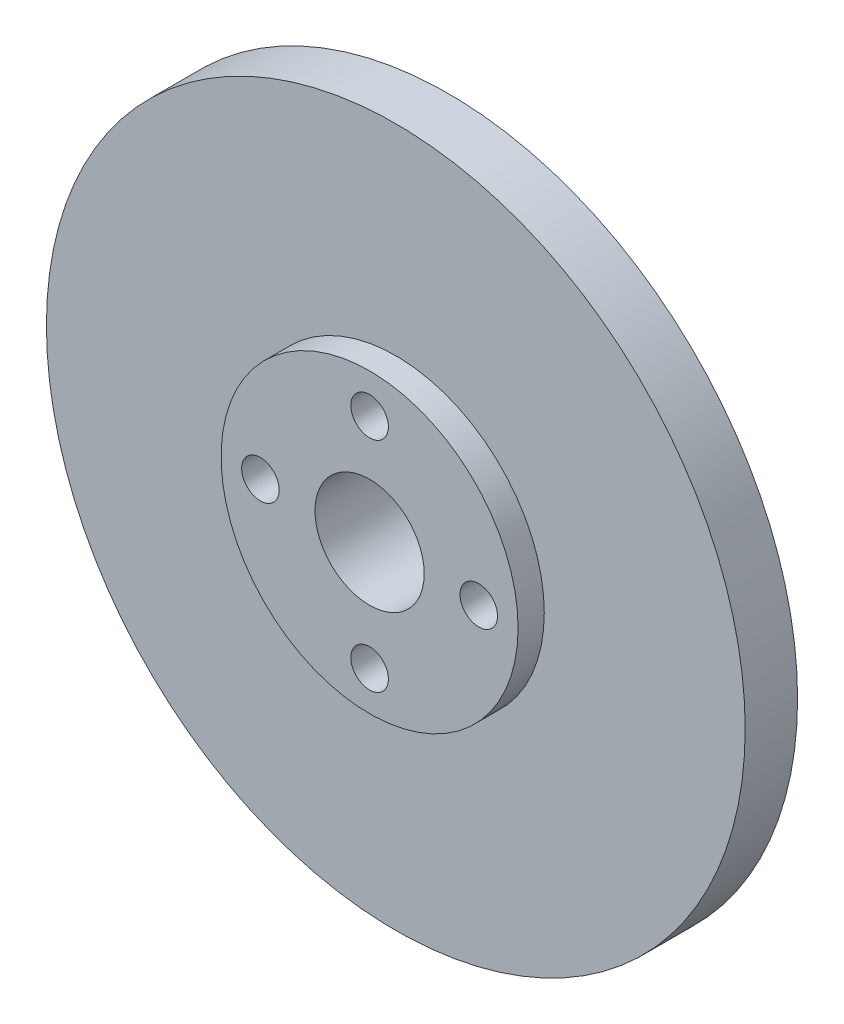
ISO-10303-21;
HEADER;
FILE_DESCRIPTION(('STEP AP214'),'2;1');
FILE_NAME('part.step','',(''),(''),'','','');
FILE_SCHEMA(('AUTOMOTIVE_DESIGN { 1 0 10303 214 1 1 1 1 }'));
ENDSEC;
DATA;
#1=APPLICATION_CONTEXT('core data for automotive mechanical design processes');
#2=APPLICATION_PROTOCOL_DEFINITION('international standard','automotive_design',2000,#1);
#3=PRODUCT_CONTEXT('',#1,'mechanical');
#4=PRODUCT('Part','Part','',(#3));
#5=PRODUCT_RELATED_PRODUCT_CATEGORY('part','',(#4));
#6=PRODUCT_DEFINITION_FORMATION('','',#4);
#7=PRODUCT_DEFINITION_CONTEXT('part definition',#1,'design');
#8=PRODUCT_DEFINITION('design','',#6,#7);
#9=PRODUCT_DEFINITION_SHAPE('','',#8);
#10=(LENGTH_UNIT() NAMED_UNIT(*) SI_UNIT(.MILLI.,.METRE.));
#11=(NAMED_UNIT(*) PLANE_ANGLE_UNIT() SI_UNIT($,.RADIAN.));
#12=(NAMED_UNIT(*) SI_UNIT($,.STERADIAN.) SOLID_ANGLE_UNIT());
#13=UNCERTAINTY_MEASURE_WITH_UNIT(LENGTH_MEASURE(1.E-05),#10,'distance_accuracy_value','');
#14=(GEOMETRIC_REPRESENTATION_CONTEXT(3) GLOBAL_UNCERTAINTY_ASSIGNED_CONTEXT((#13)) GLOBAL_UNIT_ASSIGNED_CONTEXT((#10,
#11,#12)) REPRESENTATION_CONTEXT('',''));
#15=CARTESIAN_POINT('',(0.,0.,0.));
#16=DIRECTION('',(0.,0.,1.));
#17=DIRECTION('',(1.,0.,0.));
#18=AXIS2_PLACEMENT_3D('',#15,#16,#17);
#19=CARTESIAN_POINT('',(0.,0.,6.));
#20=DIRECTION('',(0.,0.,-1.));
#21=DIRECTION('',(-1.,0.,0.));
#22=AXIS2_PLACEMENT_3D('',#19,#20,#21);
#23=CYLINDRICAL_SURFACE('',#22,40.);
#24=CARTESIAN_POINT('',(0.,0.,6.));
#25=DIRECTION('',(0.,0.,1.));
#26=DIRECTION('',(1.,0.,0.));
#27=AXIS2_PLACEMENT_3D('',#24,#25,#26);
#28=CIRCLE('',#27,40.);
#29=CARTESIAN_POINT('',(40.,0.,6.));
#30=VERTEX_POINT('',#29);
#31=EDGE_CURVE('E49',#30,#30,#28,.T.);
#32=ORIENTED_EDGE('',*,*,#31,.F.);
#33=EDGE_LOOP('',(#32));
#34=FACE_BOUND('',#33,.T.);
#35=CARTESIAN_POINT('',(0.,0.,0.));
#36=DIRECTION('',(0.,0.,1.));
#37=DIRECTION('',(1.,0.,0.));
#38=AXIS2_PLACEMENT_3D('',#35,#36,#37);
#39=CIRCLE('',#38,40.);
#40=CARTESIAN_POINT('',(40.,0.,0.));
#41=VERTEX_POINT('',#40);
#42=EDGE_CURVE('E55',#41,#41,#39,.T.);
#43=ORIENTED_EDGE('',*,*,#42,.T.);
#44=EDGE_LOOP('',(#43));
#45=FACE_BOUND('',#44,.T.);
#46=ADVANCED_FACE('F41',(#34,#45),#23,.T.);
#47=CARTESIAN_POINT('',(0.,0.,6.));
#48=DIRECTION('',(0.,0.,1.));
#49=DIRECTION('',(1.,0.,0.));
#50=AXIS2_PLACEMENT_3D('',#47,#48,#49);
#51=PLANE('',#50);
#52=CARTESIAN_POINT('',(0.,0.,6.));
#53=DIRECTION('',(0.,0.,1.));
#54=DIRECTION('',(1.,0.,0.));
#55=AXIS2_PLACEMENT_3D('',#52,#53,#54);
#56=CIRCLE('',#55,17.);
#57=CARTESIAN_POINT('',(17.,0.,6.));
#58=VERTEX_POINT('',#57);
#59=EDGE_CURVE('E10',#58,#58,#56,.T.);
#60=ORIENTED_EDGE('',*,*,#59,.F.);
#61=EDGE_LOOP('',(#60));
#62=FACE_BOUND('',#61,.T.);
#63=ORIENTED_EDGE('',*,*,#31,.T.);
#64=EDGE_LOOP('',(#63));
#65=FACE_BOUND('',#64,.T.);
#66=ADVANCED_FACE('F102',(#62,#65),#51,.T.);
#67=CARTESIAN_POINT('',(0.,0.,0.));
#68=DIRECTION('',(0.,0.,1.));
#69=DIRECTION('',(1.,0.,0.));
#70=AXIS2_PLACEMENT_3D('',#67,#68,#69);
#71=PLANE('',#70);
#72=CARTESIAN_POINT('',(0.,12.5,0.));
#73=DIRECTION('',(0.,0.,1.));
#74=DIRECTION('',(1.,0.,0.));
#75=AXIS2_PLACEMENT_3D('',#72,#73,#74);
#76=CIRCLE('',#75,2.15);
#77=CARTESIAN_POINT('',(2.15,12.5,0.));
#78=VERTEX_POINT('',#77);
#79=EDGE_CURVE('E212',#78,#78,#76,.T.);
#80=ORIENTED_EDGE('',*,*,#79,.T.);
#81=EDGE_LOOP('',(#80));
#82=FACE_BOUND('',#81,.T.);
#83=CARTESIAN_POINT('',(12.5,0.,0.));
#84=DIRECTION('',(0.,0.,1.));
#85=DIRECTION('',(1.,0.,0.));
#86=AXIS2_PLACEMENT_3D('',#83,#84,#85);
#87=CIRCLE('',#86,2.15);
#88=CARTESIAN_POINT('',(14.65,0.,0.));
#89=VERTEX_POINT('',#88);
#90=EDGE_CURVE('E214',#89,#89,#87,.T.);
#91=ORIENTED_EDGE('',*,*,#90,.T.);
#92=EDGE_LOOP('',(#91));
#93=FACE_BOUND('',#92,.T.);
#94=CARTESIAN_POINT('',(0.,-12.5,0.));
#95=DIRECTION('',(0.,0.,1.));
#96=DIRECTION('',(1.,0.,0.));
#97=AXIS2_PLACEMENT_3D('',#94,#95,#96);
#98=CIRCLE('',#97,2.15);
#99=CARTESIAN_POINT('',(2.14999999999991,-12.5,0.));
#100=VERTEX_POINT('',#99);
#101=EDGE_CURVE('E220',#100,#100,#98,.T.);
#102=ORIENTED_EDGE('',*,*,#101,.T.);
#103=EDGE_LOOP('',(#102));
#104=FACE_BOUND('',#103,.T.);
#105=CARTESIAN_POINT('',(-12.5,1.30930550206618E-13,0.));
#106=DIRECTION('',(0.,0.,1.));
#107=DIRECTION('',(1.,0.,0.));
#108=AXIS2_PLACEMENT_3D('',#105,#106,#107);
#109=CIRCLE('',#108,2.15);
#110=CARTESIAN_POINT('',(-10.35,1.30930550206618E-13,0.));
#111=VERTEX_POINT('',#110);
#112=EDGE_CURVE('E223',#111,#111,#109,.T.);
#113=ORIENTED_EDGE('',*,*,#112,.T.);
#114=EDGE_LOOP('',(#113));
#115=FACE_BOUND('',#114,.T.);
#116=CARTESIAN_POINT('',(0.,0.,0.));
#117=DIRECTION('',(0.,0.,1.));
#118=DIRECTION('',(1.,0.,0.));
#119=AXIS2_PLACEMENT_3D('',#116,#117,#118);
#120=CIRCLE('',#119,6.25);
#121=CARTESIAN_POINT('',(6.25,0.,0.));
#122=VERTEX_POINT('',#121);
#123=EDGE_CURVE('E69',#122,#122,#120,.T.);
#124=ORIENTED_EDGE('',*,*,#123,.T.);
#125=EDGE_LOOP('',(#124));
#126=FACE_BOUND('',#125,.T.);
#127=ORIENTED_EDGE('',*,*,#42,.F.);
#128=EDGE_LOOP('',(#127));
#129=FACE_BOUND('',#128,.T.);
#130=ADVANCED_FACE('F93',(#82,#93,#104,#115,#126,#129),#71,.F.);
#131=CARTESIAN_POINT('',(0.,0.,9.));
#132=DIRECTION('',(0.,0.,-1.));
#133=DIRECTION('',(-1.,0.,0.));
#134=AXIS2_PLACEMENT_3D('',#131,#132,#133);
#135=CYLINDRICAL_SURFACE('',#134,17.);
#136=CARTESIAN_POINT('',(0.,0.,9.));
#137=DIRECTION('',(0.,0.,1.));
#138=DIRECTION('',(1.,0.,0.));
#139=AXIS2_PLACEMENT_3D('',#136,#137,#138);
#140=CIRCLE('',#139,17.);
#141=CARTESIAN_POINT('',(17.,0.,9.));
#142=VERTEX_POINT('',#141);
#143=EDGE_CURVE('E58',#142,#142,#140,.T.);
#144=ORIENTED_EDGE('',*,*,#143,.F.);
#145=EDGE_LOOP('',(#144));
#146=FACE_BOUND('',#145,.T.);
#147=ORIENTED_EDGE('',*,*,#59,.T.);
#148=EDGE_LOOP('',(#147));
#149=FACE_BOUND('',#148,.T.);
#150=ADVANCED_FACE('F91',(#146,#149),#135,.T.);
#151=CARTESIAN_POINT('',(0.,0.,9.));
#152=DIRECTION('',(0.,0.,1.));
#153=DIRECTION('',(1.,0.,0.));
#154=AXIS2_PLACEMENT_3D('',#151,#152,#153);
#155=PLANE('',#154);
#156=CARTESIAN_POINT('',(0.,12.5,9.));
#157=DIRECTION('',(0.,0.,1.));
#158=DIRECTION('',(1.,0.,0.));
#159=AXIS2_PLACEMENT_3D('',#156,#157,#158);
#160=CIRCLE('',#159,2.15);
#161=CARTESIAN_POINT('',(2.15,12.5,9.));
#162=VERTEX_POINT('',#161);
#163=EDGE_CURVE('E44',#162,#162,#160,.T.);
#164=ORIENTED_EDGE('',*,*,#163,.F.);
#165=EDGE_LOOP('',(#164));
#166=FACE_BOUND('',#165,.T.);
#167=CARTESIAN_POINT('',(12.5,0.,9.));
#168=DIRECTION('',(0.,0.,1.));
#169=DIRECTION('',(1.,0.,0.));
#170=AXIS2_PLACEMENT_3D('',#167,#168,#169);
#171=CIRCLE('',#170,2.15);
#172=CARTESIAN_POINT('',(14.65,0.,9.));
#173=VERTEX_POINT('',#172);
#174=EDGE_CURVE('E76',#173,#173,#171,.T.);
#175=ORIENTED_EDGE('',*,*,#174,.F.);
#176=EDGE_LOOP('',(#175));
#177=FACE_BOUND('',#176,.T.);
#178=CARTESIAN_POINT('',(0.,-12.5,9.));
#179=DIRECTION('',(0.,0.,1.));
#180=DIRECTION('',(1.,0.,0.));
#181=AXIS2_PLACEMENT_3D('',#178,#179,#180);
#182=CIRCLE('',#181,2.15);
#183=CARTESIAN_POINT('',(2.14999999999991,-12.5,9.));
#184=VERTEX_POINT('',#183);
#185=EDGE_CURVE('E73',#184,#184,#182,.T.);
#186=ORIENTED_EDGE('',*,*,#185,.F.);
#187=EDGE_LOOP('',(#186));
#188=FACE_BOUND('',#187,.T.);
#189=CARTESIAN_POINT('',(-12.5,1.30930550206618E-13,9.));
#190=DIRECTION('',(0.,0.,1.));
#191=DIRECTION('',(1.,0.,0.));
#192=AXIS2_PLACEMENT_3D('',#189,#190,#191);
#193=CIRCLE('',#192,2.15);
#194=CARTESIAN_POINT('',(-10.35,1.30930550206618E-13,9.));
#195=VERTEX_POINT('',#194);
#196=EDGE_CURVE('E68',#195,#195,#193,.T.);
#197=ORIENTED_EDGE('',*,*,#196,.F.);
#198=EDGE_LOOP('',(#197));
#199=FACE_BOUND('',#198,.T.);
#200=CARTESIAN_POINT('',(0.,0.,9.));
#201=DIRECTION('',(0.,0.,1.));
#202=DIRECTION('',(1.,0.,0.));
#203=AXIS2_PLACEMENT_3D('',#200,#201,#202);
#204=CIRCLE('',#203,6.25);
#205=CARTESIAN_POINT('',(6.25,0.,9.));
#206=VERTEX_POINT('',#205);
#207=EDGE_CURVE('E64',#206,#206,#204,.T.);
#208=ORIENTED_EDGE('',*,*,#207,.F.);
#209=EDGE_LOOP('',(#208));
#210=FACE_BOUND('',#209,.T.);
#211=ORIENTED_EDGE('',*,*,#143,.T.);
#212=EDGE_LOOP('',(#211));
#213=FACE_BOUND('',#212,.T.);
#214=ADVANCED_FACE('F89',(#166,#177,#188,#199,#210,#213),#155,.T.);
#215=CARTESIAN_POINT('',(0.,0.,0.));
#216=DIRECTION('',(0.,0.,1.));
#217=DIRECTION('',(1.,0.,0.));
#218=AXIS2_PLACEMENT_3D('',#215,#216,#217);
#219=CYLINDRICAL_SURFACE('',#218,6.25);
#220=ORIENTED_EDGE('',*,*,#207,.T.);
#221=EDGE_LOOP('',(#220));
#222=FACE_BOUND('',#221,.T.);
#223=ORIENTED_EDGE('',*,*,#123,.F.);
#224=EDGE_LOOP('',(#223));
#225=FACE_BOUND('',#224,.T.);
#226=ADVANCED_FACE('F99',(#222,#225),#219,.F.);
#227=CARTESIAN_POINT('',(-12.5,1.30930550206618E-13,0.));
#228=DIRECTION('',(0.,0.,1.));
#229=DIRECTION('',(1.,0.,0.));
#230=AXIS2_PLACEMENT_3D('',#227,#228,#229);
#231=CYLINDRICAL_SURFACE('',#230,2.15);
#232=ORIENTED_EDGE('',*,*,#196,.T.);
#233=EDGE_LOOP('',(#232));
#234=FACE_BOUND('',#233,.T.);
#235=ORIENTED_EDGE('',*,*,#112,.F.);
#236=EDGE_LOOP('',(#235));
#237=FACE_BOUND('',#236,.T.);
#238=ADVANCED_FACE('F141',(#234,#237),#231,.F.);
#239=CARTESIAN_POINT('',(0.,-12.5,0.));
#240=DIRECTION('',(0.,0.,1.));
#241=DIRECTION('',(1.,0.,0.));
#242=AXIS2_PLACEMENT_3D('',#239,#240,#241);
#243=CYLINDRICAL_SURFACE('',#242,2.15);
#244=ORIENTED_EDGE('',*,*,#185,.T.);
#245=EDGE_LOOP('',(#244));
#246=FACE_BOUND('',#245,.T.);
#247=ORIENTED_EDGE('',*,*,#101,.F.);
#248=EDGE_LOOP('',(#247));
#249=FACE_BOUND('',#248,.T.);
#250=ADVANCED_FACE('F152',(#246,#249),#243,.F.);
#251=CARTESIAN_POINT('',(12.5,0.,0.));
#252=DIRECTION('',(0.,0.,1.));
#253=DIRECTION('',(1.,0.,0.));
#254=AXIS2_PLACEMENT_3D('',#251,#252,#253);
#255=CYLINDRICAL_SURFACE('',#254,2.15);
#256=ORIENTED_EDGE('',*,*,#174,.T.);
#257=EDGE_LOOP('',(#256));
#258=FACE_BOUND('',#257,.T.);
#259=ORIENTED_EDGE('',*,*,#90,.F.);
#260=EDGE_LOOP('',(#259));
#261=FACE_BOUND('',#260,.T.);
#262=ADVANCED_FACE('F163',(#258,#261),#255,.F.);
#263=CARTESIAN_POINT('',(0.,12.5,0.));
#264=DIRECTION('',(0.,0.,1.));
#265=DIRECTION('',(1.,0.,0.));
#266=AXIS2_PLACEMENT_3D('',#263,#264,#265);
#267=CYLINDRICAL_SURFACE('',#266,2.15);
#268=ORIENTED_EDGE('',*,*,#163,.T.);
#269=EDGE_LOOP('',(#268));
#270=FACE_BOUND('',#269,.T.);
#271=ORIENTED_EDGE('',*,*,#79,.F.);
#272=EDGE_LOOP('',(#271));
#273=FACE_BOUND('',#272,.T.);
#274=ADVANCED_FACE('F174',(#270,#273),#267,.F.);
#275=CLOSED_SHELL('',(#46,#66,#130,#150,#214,#226,#238,#250,#262,#274));
#276=MANIFOLD_SOLID_BREP('B2',#275);
#277=ADVANCED_BREP_SHAPE_REPRESENTATION('',(#18,#276),#14);
#278=SHAPE_DEFINITION_REPRESENTATION(#9,#277);
ENDSEC;
END-ISO-10303-21;
